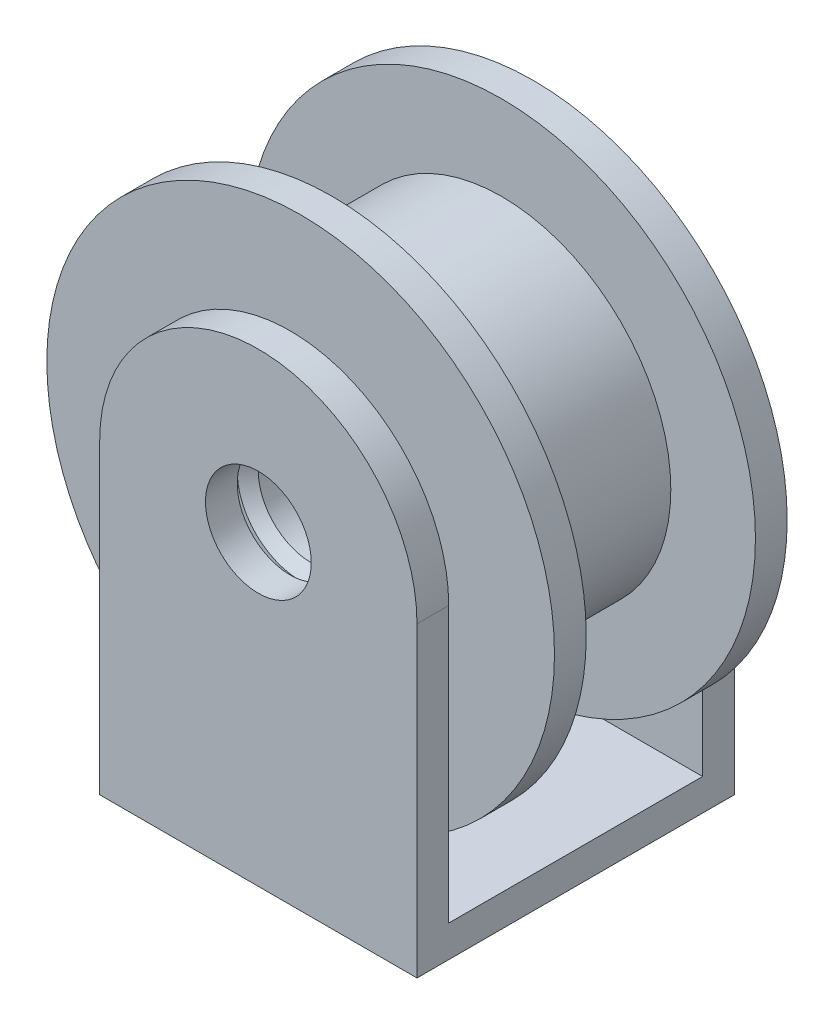
ISO-10303-21;
HEADER;
FILE_DESCRIPTION(('STEP AP214'),'2;1');
FILE_NAME('part.step','',(''),(''),'','','');
FILE_SCHEMA(('AUTOMOTIVE_DESIGN { 1 0 10303 214 1 1 1 1 }'));
ENDSEC;
DATA;
#1=APPLICATION_CONTEXT('core data for automotive mechanical design processes');
#2=APPLICATION_PROTOCOL_DEFINITION('international standard','automotive_design',2000,#1);
#3=PRODUCT_CONTEXT('',#1,'mechanical');
#4=PRODUCT('Part','Part','',(#3));
#5=PRODUCT_RELATED_PRODUCT_CATEGORY('part','',(#4));
#6=PRODUCT_DEFINITION_FORMATION('','',#4);
#7=PRODUCT_DEFINITION_CONTEXT('part definition',#1,'design');
#8=PRODUCT_DEFINITION('design','',#6,#7);
#9=PRODUCT_DEFINITION_SHAPE('','',#8);
#10=(LENGTH_UNIT() NAMED_UNIT(*) SI_UNIT(.MILLI.,.METRE.));
#11=(NAMED_UNIT(*) PLANE_ANGLE_UNIT() SI_UNIT($,.RADIAN.));
#12=(NAMED_UNIT(*) SI_UNIT($,.STERADIAN.) SOLID_ANGLE_UNIT());
#13=UNCERTAINTY_MEASURE_WITH_UNIT(LENGTH_MEASURE(1.E-05),#10,'distance_accuracy_value','');
#14=(GEOMETRIC_REPRESENTATION_CONTEXT(3) GLOBAL_UNCERTAINTY_ASSIGNED_CONTEXT((#13)) GLOBAL_UNIT_ASSIGNED_CONTEXT((#10,
#11,#12)) REPRESENTATION_CONTEXT('',''));
#15=CARTESIAN_POINT('',(0.,0.,0.));
#16=DIRECTION('',(0.,0.,1.));
#17=DIRECTION('',(1.,0.,0.));
#18=AXIS2_PLACEMENT_3D('',#15,#16,#17);
#19=CARTESIAN_POINT('',(0.,0.,-4.));
#20=DIRECTION('',(0.,0.,-1.));
#21=DIRECTION('',(-1.,0.,0.));
#22=AXIS2_PLACEMENT_3D('',#19,#20,#21);
#23=PLANE('',#22);
#24=CARTESIAN_POINT('',(0.,0.,-4.));
#25=DIRECTION('',(0.,0.,-1.));
#26=DIRECTION('',(-1.,0.,0.));
#27=AXIS2_PLACEMENT_3D('',#24,#25,#26);
#28=CIRCLE('',#27,5.);
#29=CARTESIAN_POINT('',(-5.,0.,-4.));
#30=VERTEX_POINT('',#29);
#31=EDGE_CURVE('E178',#30,#30,#28,.T.);
#32=ORIENTED_EDGE('',*,*,#31,.T.);
#33=EDGE_LOOP('',(#32));
#34=FACE_BOUND('',#33,.T.);
#35=DIRECTION('',(-1.,0.,0.));
#36=VECTOR('',#35,1.);
#37=CARTESIAN_POINT('',(15.,-26.,-4.));
#38=LINE('',#37,#36);
#39=CARTESIAN_POINT('',(15.,-26.,-4.));
#40=VERTEX_POINT('',#39);
#41=CARTESIAN_POINT('',(-15.,-26.,-4.));
#42=VERTEX_POINT('',#41);
#43=EDGE_CURVE('E67',#40,#42,#38,.T.);
#44=ORIENTED_EDGE('',*,*,#43,.F.);
#45=DIRECTION('',(0.,-1.,0.));
#46=VECTOR('',#45,1.);
#47=CARTESIAN_POINT('',(15.,0.,-4.));
#48=LINE('',#47,#46);
#49=CARTESIAN_POINT('',(15.,0.,-4.));
#50=VERTEX_POINT('',#49);
#51=EDGE_CURVE('E113',#50,#40,#48,.T.);
#52=ORIENTED_EDGE('',*,*,#51,.F.);
#53=CARTESIAN_POINT('',(0.,0.,-4.));
#54=DIRECTION('',(0.,0.,-1.));
#55=DIRECTION('',(-1.,0.,0.));
#56=AXIS2_PLACEMENT_3D('',#53,#54,#55);
#57=CIRCLE('',#56,15.);
#58=CARTESIAN_POINT('',(-15.,0.,-4.));
#59=VERTEX_POINT('',#58);
#60=EDGE_CURVE('E111',#59,#50,#57,.T.);
#61=ORIENTED_EDGE('',*,*,#60,.F.);
#62=DIRECTION('',(0.,1.,0.));
#63=VECTOR('',#62,1.);
#64=CARTESIAN_POINT('',(-15.,-29.,-4.));
#65=LINE('',#64,#63);
#66=EDGE_CURVE('E74',#42,#59,#65,.T.);
#67=ORIENTED_EDGE('',*,*,#66,.F.);
#68=EDGE_LOOP('',(#44,#52,#61,#67));
#69=FACE_BOUND('',#68,.T.);
#70=ADVANCED_FACE('F50',(#34,#69),#23,.F.);
#71=CARTESIAN_POINT('',(0.,0.,-4.));
#72=DIRECTION('',(0.,0.,-1.));
#73=DIRECTION('',(-1.,0.,0.));
#74=AXIS2_PLACEMENT_3D('',#71,#72,#73);
#75=CYLINDRICAL_SURFACE('',#74,15.);
#76=CARTESIAN_POINT('',(0.,0.,-7.));
#77=DIRECTION('',(0.,0.,-1.));
#78=DIRECTION('',(-1.,0.,0.));
#79=AXIS2_PLACEMENT_3D('',#76,#77,#78);
#80=CIRCLE('',#79,15.);
#81=CARTESIAN_POINT('',(-15.,0.,-7.));
#82=VERTEX_POINT('',#81);
#83=CARTESIAN_POINT('',(15.,0.,-7.));
#84=VERTEX_POINT('',#83);
#85=EDGE_CURVE('E100',#82,#84,#80,.T.);
#86=ORIENTED_EDGE('',*,*,#85,.F.);
#87=DIRECTION('',(0.,0.,-1.));
#88=VECTOR('',#87,1.);
#89=CARTESIAN_POINT('',(-15.,0.,-4.));
#90=LINE('',#89,#88);
#91=EDGE_CURVE('E12',#59,#82,#90,.T.);
#92=ORIENTED_EDGE('',*,*,#91,.F.);
#93=ORIENTED_EDGE('',*,*,#60,.T.);
#94=DIRECTION('',(0.,0.,-1.));
#95=VECTOR('',#94,1.);
#96=CARTESIAN_POINT('',(15.,0.,-4.));
#97=LINE('',#96,#95);
#98=EDGE_CURVE('E54',#50,#84,#97,.T.);
#99=ORIENTED_EDGE('',*,*,#98,.T.);
#100=EDGE_LOOP('',(#86,#92,#93,#99));
#101=FACE_BOUND('',#100,.T.);
#102=ADVANCED_FACE('F52',(#101),#75,.T.);
#103=CARTESIAN_POINT('',(-15.,-29.,-4.));
#104=DIRECTION('',(-1.,0.,0.));
#105=DIRECTION('',(0.,0.,1.));
#106=AXIS2_PLACEMENT_3D('',#103,#104,#105);
#107=PLANE('',#106);
#108=DIRECTION('',(0.,1.,0.));
#109=VECTOR('',#108,1.);
#110=CARTESIAN_POINT('',(-15.,-29.,-7.));
#111=LINE('',#110,#109);
#112=CARTESIAN_POINT('',(-15.,-29.,-7.));
#113=VERTEX_POINT('',#112);
#114=EDGE_CURVE('E95',#113,#82,#111,.T.);
#115=ORIENTED_EDGE('',*,*,#114,.F.);
#116=DIRECTION('',(0.,0.,-1.));
#117=VECTOR('',#116,1.);
#118=CARTESIAN_POINT('',(-15.,-29.,-4.));
#119=LINE('',#118,#117);
#120=CARTESIAN_POINT('',(-15.,-29.,23.));
#121=VERTEX_POINT('',#120);
#122=EDGE_CURVE('E59',#121,#113,#119,.T.);
#123=ORIENTED_EDGE('',*,*,#122,.F.);
#124=DIRECTION('',(0.,1.,0.));
#125=VECTOR('',#124,1.);
#126=CARTESIAN_POINT('',(-15.,-29.,23.));
#127=LINE('',#126,#125);
#128=CARTESIAN_POINT('',(-15.,0.,23.));
#129=VERTEX_POINT('',#128);
#130=EDGE_CURVE('E169',#121,#129,#127,.T.);
#131=ORIENTED_EDGE('',*,*,#130,.T.);
#132=DIRECTION('',(0.,0.,1.));
#133=VECTOR('',#132,1.);
#134=CARTESIAN_POINT('',(-15.,0.,20.));
#135=LINE('',#134,#133);
#136=CARTESIAN_POINT('',(-15.,0.,20.));
#137=VERTEX_POINT('',#136);
#138=EDGE_CURVE('E142',#137,#129,#135,.T.);
#139=ORIENTED_EDGE('',*,*,#138,.F.);
#140=DIRECTION('',(0.,1.,0.));
#141=VECTOR('',#140,1.);
#142=CARTESIAN_POINT('',(-15.,-29.,20.));
#143=LINE('',#142,#141);
#144=CARTESIAN_POINT('',(-15.,-26.,20.));
#145=VERTEX_POINT('',#144);
#146=EDGE_CURVE('E135',#145,#137,#143,.T.);
#147=ORIENTED_EDGE('',*,*,#146,.F.);
#148=DIRECTION('',(0.,0.,-1.));
#149=VECTOR('',#148,1.);
#150=CARTESIAN_POINT('',(-15.,-26.,23.002));
#151=LINE('',#150,#149);
#152=EDGE_CURVE('E132',#145,#42,#151,.T.);
#153=ORIENTED_EDGE('',*,*,#152,.T.);
#154=ORIENTED_EDGE('',*,*,#66,.T.);
#155=ORIENTED_EDGE('',*,*,#91,.T.);
#156=EDGE_LOOP('',(#115,#123,#131,#139,#147,#153,#154,#155));
#157=FACE_BOUND('',#156,.T.);
#158=ADVANCED_FACE('F92',(#157),#107,.T.);
#159=CARTESIAN_POINT('',(15.,-29.,-4.));
#160=DIRECTION('',(0.,-1.,0.));
#161=DIRECTION('',(0.,0.,-1.));
#162=AXIS2_PLACEMENT_3D('',#159,#160,#161);
#163=PLANE('',#162);
#164=CARTESIAN_POINT('',(0.,-29.,8.));
#165=DIRECTION('',(0.,-1.,0.));
#166=DIRECTION('',(0.,0.,-1.));
#167=AXIS2_PLACEMENT_3D('',#164,#165,#166);
#168=CIRCLE('',#167,5.);
#169=CARTESIAN_POINT('',(0.,-29.,3.));
#170=VERTEX_POINT('',#169);
#171=EDGE_CURVE('E234',#170,#170,#168,.T.);
#172=ORIENTED_EDGE('',*,*,#171,.F.);
#173=EDGE_LOOP('',(#172));
#174=FACE_BOUND('',#173,.T.);
#175=DIRECTION('',(-1.,0.,0.));
#176=VECTOR('',#175,1.);
#177=CARTESIAN_POINT('',(15.,-29.,-7.));
#178=LINE('',#177,#176);
#179=CARTESIAN_POINT('',(15.,-29.,-7.));
#180=VERTEX_POINT('',#179);
#181=EDGE_CURVE('E110',#180,#113,#178,.T.);
#182=ORIENTED_EDGE('',*,*,#181,.F.);
#183=DIRECTION('',(0.,0.,-1.));
#184=VECTOR('',#183,1.);
#185=CARTESIAN_POINT('',(15.,-29.,-4.));
#186=LINE('',#185,#184);
#187=CARTESIAN_POINT('',(15.,-29.,23.));
#188=VERTEX_POINT('',#187);
#189=EDGE_CURVE('E118',#188,#180,#186,.T.);
#190=ORIENTED_EDGE('',*,*,#189,.F.);
#191=DIRECTION('',(-1.,0.,0.));
#192=VECTOR('',#191,1.);
#193=CARTESIAN_POINT('',(15.,-29.,23.));
#194=LINE('',#193,#192);
#195=EDGE_CURVE('E180',#188,#121,#194,.T.);
#196=ORIENTED_EDGE('',*,*,#195,.T.);
#197=ORIENTED_EDGE('',*,*,#122,.T.);
#198=EDGE_LOOP('',(#182,#190,#196,#197));
#199=FACE_BOUND('',#198,.T.);
#200=ADVANCED_FACE('F197',(#174,#199),#163,.T.);
#201=CARTESIAN_POINT('',(15.,0.,-4.));
#202=DIRECTION('',(1.,0.,0.));
#203=DIRECTION('',(0.,1.,0.));
#204=AXIS2_PLACEMENT_3D('',#201,#202,#203);
#205=PLANE('',#204);
#206=DIRECTION('',(0.,-1.,0.));
#207=VECTOR('',#206,1.);
#208=CARTESIAN_POINT('',(15.,0.,-7.));
#209=LINE('',#208,#207);
#210=EDGE_CURVE('E104',#84,#180,#209,.T.);
#211=ORIENTED_EDGE('',*,*,#210,.F.);
#212=ORIENTED_EDGE('',*,*,#98,.F.);
#213=ORIENTED_EDGE('',*,*,#51,.T.);
#214=DIRECTION('',(0.,0.,-1.));
#215=VECTOR('',#214,1.);
#216=CARTESIAN_POINT('',(15.,-26.,23.002));
#217=LINE('',#216,#215);
#218=CARTESIAN_POINT('',(15.,-26.,20.));
#219=VERTEX_POINT('',#218);
#220=EDGE_CURVE('E139',#219,#40,#217,.T.);
#221=ORIENTED_EDGE('',*,*,#220,.F.);
#222=DIRECTION('',(0.,-1.,0.));
#223=VECTOR('',#222,1.);
#224=CARTESIAN_POINT('',(15.,0.,20.));
#225=LINE('',#224,#223);
#226=CARTESIAN_POINT('',(15.,0.,20.));
#227=VERTEX_POINT('',#226);
#228=EDGE_CURVE('E156',#227,#219,#225,.T.);
#229=ORIENTED_EDGE('',*,*,#228,.F.);
#230=DIRECTION('',(0.,0.,1.));
#231=VECTOR('',#230,1.);
#232=CARTESIAN_POINT('',(15.,0.,20.));
#233=LINE('',#232,#231);
#234=CARTESIAN_POINT('',(15.,0.,23.));
#235=VERTEX_POINT('',#234);
#236=EDGE_CURVE('E145',#227,#235,#233,.T.);
#237=ORIENTED_EDGE('',*,*,#236,.T.);
#238=DIRECTION('',(0.,-1.,0.));
#239=VECTOR('',#238,1.);
#240=CARTESIAN_POINT('',(15.,0.,23.));
#241=LINE('',#240,#239);
#242=EDGE_CURVE('E177',#235,#188,#241,.T.);
#243=ORIENTED_EDGE('',*,*,#242,.T.);
#244=ORIENTED_EDGE('',*,*,#189,.T.);
#245=EDGE_LOOP('',(#211,#212,#213,#221,#229,#237,#243,#244));
#246=FACE_BOUND('',#245,.T.);
#247=ADVANCED_FACE('F124',(#246),#205,.T.);
#248=CARTESIAN_POINT('',(0.,0.,-7.));
#249=DIRECTION('',(0.,0.,-1.));
#250=DIRECTION('',(-1.,0.,0.));
#251=AXIS2_PLACEMENT_3D('',#248,#249,#250);
#252=PLANE('',#251);
#253=CARTESIAN_POINT('',(0.,0.,-7.));
#254=DIRECTION('',(0.,0.,-1.));
#255=DIRECTION('',(-1.,0.,0.));
#256=AXIS2_PLACEMENT_3D('',#253,#254,#255);
#257=CIRCLE('',#256,5.);
#258=CARTESIAN_POINT('',(-5.,0.,-7.));
#259=VERTEX_POINT('',#258);
#260=EDGE_CURVE('E225',#259,#259,#257,.T.);
#261=ORIENTED_EDGE('',*,*,#260,.F.);
#262=EDGE_LOOP('',(#261));
#263=FACE_BOUND('',#262,.T.);
#264=ORIENTED_EDGE('',*,*,#85,.T.);
#265=ORIENTED_EDGE('',*,*,#210,.T.);
#266=ORIENTED_EDGE('',*,*,#181,.T.);
#267=ORIENTED_EDGE('',*,*,#114,.T.);
#268=EDGE_LOOP('',(#264,#265,#266,#267));
#269=FACE_BOUND('',#268,.T.);
#270=ADVANCED_FACE('F108',(#263,#269),#252,.T.);
#271=CARTESIAN_POINT('',(15.,-26.,23.002));
#272=DIRECTION('',(0.,-1.,0.));
#273=DIRECTION('',(1.,0.,0.));
#274=AXIS2_PLACEMENT_3D('',#271,#272,#273);
#275=PLANE('',#274);
#276=CARTESIAN_POINT('',(0.,-26.,8.));
#277=DIRECTION('',(0.,-1.,0.));
#278=DIRECTION('',(1.,0.,0.));
#279=AXIS2_PLACEMENT_3D('',#276,#277,#278);
#280=CIRCLE('',#279,5.);
#281=CARTESIAN_POINT('',(5.,-26.,8.));
#282=VERTEX_POINT('',#281);
#283=EDGE_CURVE('E228',#282,#282,#280,.F.);
#284=ORIENTED_EDGE('',*,*,#283,.F.);
#285=EDGE_LOOP('',(#284));
#286=FACE_BOUND('',#285,.T.);
#287=DIRECTION('',(-1.,0.,0.));
#288=VECTOR('',#287,1.);
#289=CARTESIAN_POINT('',(15.,-26.,20.));
#290=LINE('',#289,#288);
#291=EDGE_CURVE('E105',#219,#145,#290,.T.);
#292=ORIENTED_EDGE('',*,*,#291,.F.);
#293=ORIENTED_EDGE('',*,*,#220,.T.);
#294=ORIENTED_EDGE('',*,*,#43,.T.);
#295=ORIENTED_EDGE('',*,*,#152,.F.);
#296=EDGE_LOOP('',(#292,#293,#294,#295));
#297=FACE_BOUND('',#296,.T.);
#298=ADVANCED_FACE('F141',(#286,#297),#275,.F.);
#299=CARTESIAN_POINT('',(0.,0.,20.));
#300=DIRECTION('',(0.,0.,1.));
#301=DIRECTION('',(-1.,0.,0.));
#302=AXIS2_PLACEMENT_3D('',#299,#300,#301);
#303=PLANE('',#302);
#304=CARTESIAN_POINT('',(0.,0.,20.));
#305=DIRECTION('',(0.,0.,1.));
#306=DIRECTION('',(1.,0.,0.));
#307=AXIS2_PLACEMENT_3D('',#304,#305,#306);
#308=CIRCLE('',#307,5.);
#309=CARTESIAN_POINT('',(5.,0.,20.));
#310=VERTEX_POINT('',#309);
#311=EDGE_CURVE('E231',#310,#310,#308,.T.);
#312=ORIENTED_EDGE('',*,*,#311,.T.);
#313=EDGE_LOOP('',(#312));
#314=FACE_BOUND('',#313,.T.);
#315=ORIENTED_EDGE('',*,*,#228,.T.);
#316=ORIENTED_EDGE('',*,*,#291,.T.);
#317=ORIENTED_EDGE('',*,*,#146,.T.);
#318=CARTESIAN_POINT('',(0.,0.,20.));
#319=DIRECTION('',(0.,0.,-1.));
#320=DIRECTION('',(-1.,0.,0.));
#321=AXIS2_PLACEMENT_3D('',#318,#319,#320);
#322=CIRCLE('',#321,15.);
#323=EDGE_CURVE('E165',#137,#227,#322,.T.);
#324=ORIENTED_EDGE('',*,*,#323,.T.);
#325=EDGE_LOOP('',(#315,#316,#317,#324));
#326=FACE_BOUND('',#325,.T.);
#327=ADVANCED_FACE('F152',(#314,#326),#303,.F.);
#328=CARTESIAN_POINT('',(0.,0.,20.));
#329=DIRECTION('',(0.,0.,1.));
#330=DIRECTION('',(-1.,0.,0.));
#331=AXIS2_PLACEMENT_3D('',#328,#329,#330);
#332=CYLINDRICAL_SURFACE('',#331,15.);
#333=CARTESIAN_POINT('',(0.,0.,23.));
#334=DIRECTION('',(0.,0.,-1.));
#335=DIRECTION('',(-1.,0.,0.));
#336=AXIS2_PLACEMENT_3D('',#333,#334,#335);
#337=CIRCLE('',#336,15.);
#338=EDGE_CURVE('E173',#129,#235,#337,.T.);
#339=ORIENTED_EDGE('',*,*,#338,.T.);
#340=ORIENTED_EDGE('',*,*,#236,.F.);
#341=ORIENTED_EDGE('',*,*,#323,.F.);
#342=ORIENTED_EDGE('',*,*,#138,.T.);
#343=EDGE_LOOP('',(#339,#340,#341,#342));
#344=FACE_BOUND('',#343,.T.);
#345=ADVANCED_FACE('F171',(#344),#332,.T.);
#346=CARTESIAN_POINT('',(0.,0.,23.));
#347=DIRECTION('',(0.,0.,1.));
#348=DIRECTION('',(-1.,0.,0.));
#349=AXIS2_PLACEMENT_3D('',#346,#347,#348);
#350=PLANE('',#349);
#351=CARTESIAN_POINT('',(0.,0.,23.));
#352=DIRECTION('',(0.,0.,1.));
#353=DIRECTION('',(1.,0.,0.));
#354=AXIS2_PLACEMENT_3D('',#351,#352,#353);
#355=CIRCLE('',#354,5.);
#356=CARTESIAN_POINT('',(5.,0.,23.));
#357=VERTEX_POINT('',#356);
#358=EDGE_CURVE('E227',#357,#357,#355,.F.);
#359=ORIENTED_EDGE('',*,*,#358,.T.);
#360=EDGE_LOOP('',(#359));
#361=FACE_BOUND('',#360,.T.);
#362=ORIENTED_EDGE('',*,*,#338,.F.);
#363=ORIENTED_EDGE('',*,*,#130,.F.);
#364=ORIENTED_EDGE('',*,*,#195,.F.);
#365=ORIENTED_EDGE('',*,*,#242,.F.);
#366=EDGE_LOOP('',(#362,#363,#364,#365));
#367=FACE_BOUND('',#366,.T.);
#368=ADVANCED_FACE('F190',(#361,#367),#350,.T.);
#369=CARTESIAN_POINT('',(0.,0.,37.142135623731));
#370=DIRECTION('',(0.,0.,-1.));
#371=DIRECTION('',(-1.,0.,0.));
#372=AXIS2_PLACEMENT_3D('',#369,#370,#371);
#373=CYLINDRICAL_SURFACE('',#372,5.);
#374=ORIENTED_EDGE('',*,*,#358,.F.);
#375=EDGE_LOOP('',(#374));
#376=FACE_BOUND('',#375,.T.);
#377=ORIENTED_EDGE('',*,*,#311,.F.);
#378=EDGE_LOOP('',(#377));
#379=FACE_BOUND('',#378,.T.);
#380=ADVANCED_FACE('F245',(#376,#379),#373,.F.);
#381=ORIENTED_EDGE('',*,*,#260,.T.);
#382=EDGE_LOOP('',(#381));
#383=FACE_BOUND('',#382,.T.);
#384=ORIENTED_EDGE('',*,*,#31,.F.);
#385=EDGE_LOOP('',(#384));
#386=FACE_BOUND('',#385,.T.);
#387=ADVANCED_FACE('F242',(#383,#386),#373,.F.);
#388=CARTESIAN_POINT('',(0.,24.001,8.));
#389=DIRECTION('',(0.,-1.,0.));
#390=DIRECTION('',(0.,0.,-1.));
#391=AXIS2_PLACEMENT_3D('',#388,#389,#390);
#392=CYLINDRICAL_SURFACE('',#391,5.);
#393=ORIENTED_EDGE('',*,*,#171,.T.);
#394=EDGE_LOOP('',(#393));
#395=FACE_BOUND('',#394,.T.);
#396=ORIENTED_EDGE('',*,*,#283,.T.);
#397=EDGE_LOOP('',(#396));
#398=FACE_BOUND('',#397,.T.);
#399=ADVANCED_FACE('F244',(#395,#398),#392,.F.);
#400=CLOSED_SHELL('',(#70,#102,#158,#200,#247,#270,#298,#327,#345,#368,#380,#387,#399));
#401=MANIFOLD_SOLID_BREP('B2',#400);
#402=CARTESIAN_POINT('',(0.,0.,16.));
#403=DIRECTION('',(0.,0.,-1.));
#404=DIRECTION('',(-1.,0.,0.));
#405=AXIS2_PLACEMENT_3D('',#402,#403,#404);
#406=CYLINDRICAL_SURFACE('',#405,16.);
#407=CARTESIAN_POINT('',(0.,0.,16.));
#408=DIRECTION('',(0.,0.,1.));
#409=DIRECTION('',(1.,0.,0.));
#410=AXIS2_PLACEMENT_3D('',#407,#408,#409);
#411=CIRCLE('',#410,16.);
#412=CARTESIAN_POINT('',(16.,0.,16.));
#413=VERTEX_POINT('',#412);
#414=EDGE_CURVE('E404',#413,#413,#411,.T.);
#415=ORIENTED_EDGE('',*,*,#414,.F.);
#416=EDGE_LOOP('',(#415));
#417=FACE_BOUND('',#416,.T.);
#418=CARTESIAN_POINT('',(0.,0.,0.));
#419=DIRECTION('',(0.,0.,1.));
#420=DIRECTION('',(1.,0.,0.));
#421=AXIS2_PLACEMENT_3D('',#418,#419,#420);
#422=CIRCLE('',#421,16.);
#423=CARTESIAN_POINT('',(16.,0.,0.));
#424=VERTEX_POINT('',#423);
#425=EDGE_CURVE('E405',#424,#424,#422,.T.);
#426=ORIENTED_EDGE('',*,*,#425,.T.);
#427=EDGE_LOOP('',(#426));
#428=FACE_BOUND('',#427,.T.);
#429=ADVANCED_FACE('F383',(#417,#428),#406,.T.);
#430=CARTESIAN_POINT('',(0.,0.,-3.));
#431=DIRECTION('',(0.,0.,1.));
#432=DIRECTION('',(1.,0.,0.));
#433=AXIS2_PLACEMENT_3D('',#430,#431,#432);
#434=CYLINDRICAL_SURFACE('',#433,24.);
#435=CARTESIAN_POINT('',(0.,0.,-3.));
#436=DIRECTION('',(0.,0.,-1.));
#437=DIRECTION('',(-1.,0.,0.));
#438=AXIS2_PLACEMENT_3D('',#435,#436,#437);
#439=CIRCLE('',#438,24.);
#440=CARTESIAN_POINT('',(-24.,0.,-3.));
#441=VERTEX_POINT('',#440);
#442=EDGE_CURVE('E408',#441,#441,#439,.T.);
#443=ORIENTED_EDGE('',*,*,#442,.F.);
#444=EDGE_LOOP('',(#443));
#445=FACE_BOUND('',#444,.T.);
#446=CARTESIAN_POINT('',(0.,0.,0.));
#447=DIRECTION('',(0.,0.,-1.));
#448=DIRECTION('',(-1.,0.,0.));
#449=AXIS2_PLACEMENT_3D('',#446,#447,#448);
#450=CIRCLE('',#449,24.);
#451=CARTESIAN_POINT('',(-24.,0.,0.));
#452=VERTEX_POINT('',#451);
#453=EDGE_CURVE('E411',#452,#452,#450,.T.);
#454=ORIENTED_EDGE('',*,*,#453,.T.);
#455=EDGE_LOOP('',(#454));
#456=FACE_BOUND('',#455,.T.);
#457=ADVANCED_FACE('F446',(#445,#456),#434,.T.);
#458=CARTESIAN_POINT('',(0.,0.,-3.));
#459=DIRECTION('',(0.,0.,-1.));
#460=DIRECTION('',(-1.,0.,0.));
#461=AXIS2_PLACEMENT_3D('',#458,#459,#460);
#462=PLANE('',#461);
#463=CARTESIAN_POINT('',(0.,0.,-3.));
#464=DIRECTION('',(0.,0.,-1.));
#465=DIRECTION('',(-1.,0.,0.));
#466=AXIS2_PLACEMENT_3D('',#463,#464,#465);
#467=CIRCLE('',#466,6.);
#468=CARTESIAN_POINT('',(-6.,0.,-3.));
#469=VERTEX_POINT('',#468);
#470=EDGE_CURVE('E49',#469,#469,#467,.F.);
#471=ORIENTED_EDGE('',*,*,#470,.T.);
#472=EDGE_LOOP('',(#471));
#473=FACE_BOUND('',#472,.T.);
#474=ORIENTED_EDGE('',*,*,#442,.T.);
#475=EDGE_LOOP('',(#474));
#476=FACE_BOUND('',#475,.T.);
#477=ADVANCED_FACE('F452',(#473,#476),#462,.T.);
#478=CARTESIAN_POINT('',(0.,0.,0.));
#479=DIRECTION('',(0.,0.,-1.));
#480=DIRECTION('',(-1.,0.,0.));
#481=AXIS2_PLACEMENT_3D('',#478,#479,#480);
#482=PLANE('',#481);
#483=ORIENTED_EDGE('',*,*,#425,.F.);
#484=EDGE_LOOP('',(#483));
#485=FACE_BOUND('',#484,.T.);
#486=ORIENTED_EDGE('',*,*,#453,.F.);
#487=EDGE_LOOP('',(#486));
#488=FACE_BOUND('',#487,.T.);
#489=ADVANCED_FACE('F428',(#485,#488),#482,.F.);
#490=CARTESIAN_POINT('',(0.,0.,19.));
#491=DIRECTION('',(0.,0.,-1.));
#492=DIRECTION('',(-1.,0.,0.));
#493=AXIS2_PLACEMENT_3D('',#490,#491,#492);
#494=CYLINDRICAL_SURFACE('',#493,24.);
#495=CARTESIAN_POINT('',(0.,0.,19.));
#496=DIRECTION('',(0.,0.,1.));
#497=DIRECTION('',(1.,0.,0.));
#498=AXIS2_PLACEMENT_3D('',#495,#496,#497);
#499=CIRCLE('',#498,24.);
#500=CARTESIAN_POINT('',(24.,0.,19.));
#501=VERTEX_POINT('',#500);
#502=EDGE_CURVE('E414',#501,#501,#499,.T.);
#503=ORIENTED_EDGE('',*,*,#502,.F.);
#504=EDGE_LOOP('',(#503));
#505=FACE_BOUND('',#504,.T.);
#506=CARTESIAN_POINT('',(0.,0.,16.));
#507=DIRECTION('',(0.,0.,1.));
#508=DIRECTION('',(1.,0.,0.));
#509=AXIS2_PLACEMENT_3D('',#506,#507,#508);
#510=CIRCLE('',#509,24.);
#511=CARTESIAN_POINT('',(24.,0.,16.));
#512=VERTEX_POINT('',#511);
#513=EDGE_CURVE('E417',#512,#512,#510,.T.);
#514=ORIENTED_EDGE('',*,*,#513,.T.);
#515=EDGE_LOOP('',(#514));
#516=FACE_BOUND('',#515,.T.);
#517=ADVANCED_FACE('F425',(#505,#516),#494,.T.);
#518=CARTESIAN_POINT('',(0.,0.,19.));
#519=DIRECTION('',(0.,0.,1.));
#520=DIRECTION('',(1.,0.,0.));
#521=AXIS2_PLACEMENT_3D('',#518,#519,#520);
#522=PLANE('',#521);
#523=CARTESIAN_POINT('',(0.,0.,19.));
#524=DIRECTION('',(0.,0.,1.));
#525=DIRECTION('',(1.,0.,0.));
#526=AXIS2_PLACEMENT_3D('',#523,#524,#525);
#527=CIRCLE('',#526,6.00000000000001);
#528=CARTESIAN_POINT('',(6.00000000000001,0.,19.));
#529=VERTEX_POINT('',#528);
#530=EDGE_CURVE('E399',#529,#529,#527,.F.);
#531=ORIENTED_EDGE('',*,*,#530,.T.);
#532=EDGE_LOOP('',(#531));
#533=FACE_BOUND('',#532,.T.);
#534=ORIENTED_EDGE('',*,*,#502,.T.);
#535=EDGE_LOOP('',(#534));
#536=FACE_BOUND('',#535,.T.);
#537=ADVANCED_FACE('F423',(#533,#536),#522,.T.);
#538=CARTESIAN_POINT('',(0.,0.,16.));
#539=DIRECTION('',(0.,0.,1.));
#540=DIRECTION('',(1.,0.,0.));
#541=AXIS2_PLACEMENT_3D('',#538,#539,#540);
#542=PLANE('',#541);
#543=ORIENTED_EDGE('',*,*,#414,.T.);
#544=EDGE_LOOP('',(#543));
#545=FACE_BOUND('',#544,.T.);
#546=ORIENTED_EDGE('',*,*,#513,.F.);
#547=EDGE_LOOP('',(#546));
#548=FACE_BOUND('',#547,.T.);
#549=ADVANCED_FACE('F432',(#545,#548),#542,.F.);
#550=CARTESIAN_POINT('',(0.,0.,33.1421356237309));
#551=DIRECTION('',(0.,0.,-1.));
#552=DIRECTION('',(-1.,0.,0.));
#553=AXIS2_PLACEMENT_3D('',#550,#551,#552);
#554=CYLINDRICAL_SURFACE('',#553,5.);
#555=CARTESIAN_POINT('',(0.,0.,18.));
#556=DIRECTION('',(0.,0.,1.));
#557=DIRECTION('',(1.,0.,0.));
#558=AXIS2_PLACEMENT_3D('',#555,#556,#557);
#559=CIRCLE('',#558,5.);
#560=CARTESIAN_POINT('',(5.,0.,18.));
#561=VERTEX_POINT('',#560);
#562=EDGE_CURVE('E391',#561,#561,#559,.T.);
#563=ORIENTED_EDGE('',*,*,#562,.T.);
#564=EDGE_LOOP('',(#563));
#565=FACE_BOUND('',#564,.T.);
#566=CARTESIAN_POINT('',(0.,0.,-2.));
#567=DIRECTION('',(0.,0.,-1.));
#568=DIRECTION('',(-1.,0.,0.));
#569=AXIS2_PLACEMENT_3D('',#566,#567,#568);
#570=CIRCLE('',#569,5.);
#571=CARTESIAN_POINT('',(-5.,0.,-2.));
#572=VERTEX_POINT('',#571);
#573=EDGE_CURVE('E395',#572,#572,#570,.T.);
#574=ORIENTED_EDGE('',*,*,#573,.T.);
#575=EDGE_LOOP('',(#574));
#576=FACE_BOUND('',#575,.T.);
#577=ADVANCED_FACE('F434',(#565,#576),#554,.F.);
#578=CARTESIAN_POINT('',(0.,0.,19.));
#579=DIRECTION('',(0.,0.,1.));
#580=DIRECTION('',(1.,0.,0.));
#581=AXIS2_PLACEMENT_3D('',#578,#579,#580);
#582=CONICAL_SURFACE('',#581,6.00000000000001,0.785398163397444);
#583=ORIENTED_EDGE('',*,*,#562,.F.);
#584=EDGE_LOOP('',(#583));
#585=FACE_BOUND('',#584,.T.);
#586=ORIENTED_EDGE('',*,*,#530,.F.);
#587=EDGE_LOOP('',(#586));
#588=FACE_BOUND('',#587,.T.);
#589=ADVANCED_FACE('F441',(#585,#588),#582,.F.);
#590=CARTESIAN_POINT('',(0.,0.,-2.));
#591=DIRECTION('',(0.,0.,-1.));
#592=DIRECTION('',(-1.,0.,0.));
#593=AXIS2_PLACEMENT_3D('',#590,#591,#592);
#594=CONICAL_SURFACE('',#593,5.,0.785398163397447);
#595=ORIENTED_EDGE('',*,*,#470,.F.);
#596=EDGE_LOOP('',(#595));
#597=FACE_BOUND('',#596,.T.);
#598=ORIENTED_EDGE('',*,*,#573,.F.);
#599=EDGE_LOOP('',(#598));
#600=FACE_BOUND('',#599,.T.);
#601=ADVANCED_FACE('F386',(#597,#600),#594,.F.);
#602=CLOSED_SHELL('',(#429,#457,#477,#489,#517,#537,#549,#577,#589,#601));
#603=MANIFOLD_SOLID_BREP('B6',#602);
#604=ADVANCED_BREP_SHAPE_REPRESENTATION('',(#18,#401,#603),#14);
#605=SHAPE_DEFINITION_REPRESENTATION(#9,#604);
ENDSEC;
END-ISO-10303-21;
